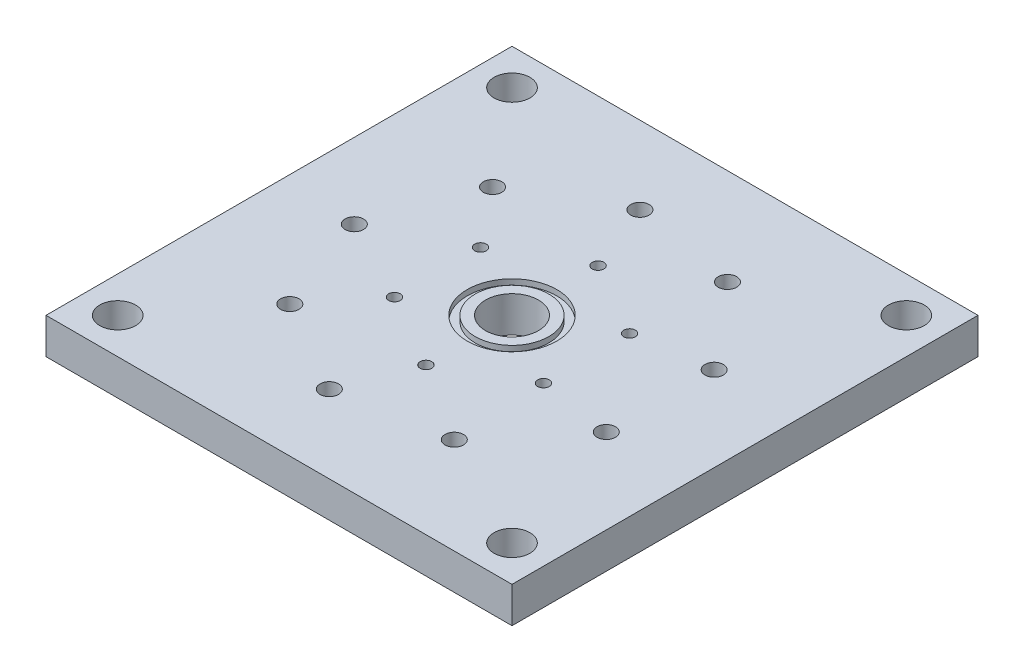
ISO-10303-21;
HEADER;
FILE_DESCRIPTION(('STEP AP214'),'2;1');
FILE_NAME('part.step','',(''),(''),'','','');
FILE_SCHEMA(('AUTOMOTIVE_DESIGN { 1 0 10303 214 1 1 1 1 }'));
ENDSEC;
DATA;
#1=APPLICATION_CONTEXT('core data for automotive mechanical design processes');
#2=APPLICATION_PROTOCOL_DEFINITION('international standard','automotive_design',2000,#1);
#3=PRODUCT_CONTEXT('',#1,'mechanical');
#4=PRODUCT('Part','Part','',(#3));
#5=PRODUCT_RELATED_PRODUCT_CATEGORY('part','',(#4));
#6=PRODUCT_DEFINITION_FORMATION('','',#4);
#7=PRODUCT_DEFINITION_CONTEXT('part definition',#1,'design');
#8=PRODUCT_DEFINITION('design','',#6,#7);
#9=PRODUCT_DEFINITION_SHAPE('','',#8);
#10=(LENGTH_UNIT() NAMED_UNIT(*) SI_UNIT(.MILLI.,.METRE.));
#11=(NAMED_UNIT(*) PLANE_ANGLE_UNIT() SI_UNIT($,.RADIAN.));
#12=(NAMED_UNIT(*) SI_UNIT($,.STERADIAN.) SOLID_ANGLE_UNIT());
#13=UNCERTAINTY_MEASURE_WITH_UNIT(LENGTH_MEASURE(1.E-05),#10,'distance_accuracy_value','');
#14=(GEOMETRIC_REPRESENTATION_CONTEXT(3) GLOBAL_UNCERTAINTY_ASSIGNED_CONTEXT((#13)) GLOBAL_UNIT_ASSIGNED_CONTEXT((#10,
#11,#12)) REPRESENTATION_CONTEXT('',''));
#15=CARTESIAN_POINT('',(0.,0.,0.));
#16=DIRECTION('',(0.,0.,1.));
#17=DIRECTION('',(1.,0.,0.));
#18=AXIS2_PLACEMENT_3D('',#15,#16,#17);
#19=CARTESIAN_POINT('',(0.,6.35,0.));
#20=DIRECTION('',(0.,-1.,0.));
#21=DIRECTION('',(0.,0.,-1.));
#22=AXIS2_PLACEMENT_3D('',#19,#20,#21);
#23=PLANE('',#22);
#24=CARTESIAN_POINT('',(0.,6.35,0.));
#25=DIRECTION('',(0.,1.,0.));
#26=DIRECTION('',(0.,0.,1.));
#27=AXIS2_PLACEMENT_3D('',#24,#25,#26);
#28=CIRCLE('',#27,4.699);
#29=CARTESIAN_POINT('',(0.,6.35,4.699));
#30=VERTEX_POINT('',#29);
#31=EDGE_CURVE('E102',#30,#30,#28,.T.);
#32=ORIENTED_EDGE('',*,*,#31,.F.);
#33=EDGE_LOOP('',(#32));
#34=FACE_BOUND('',#33,.T.);
#35=CARTESIAN_POINT('',(0.,6.35,0.));
#36=DIRECTION('',(0.,1.,0.));
#37=DIRECTION('',(0.,0.,1.));
#38=AXIS2_PLACEMENT_3D('',#35,#36,#37);
#39=CIRCLE('',#38,6.5278);
#40=CARTESIAN_POINT('',(0.,6.35,6.5278));
#41=VERTEX_POINT('',#40);
#42=EDGE_CURVE('E125',#41,#41,#39,.T.);
#43=ORIENTED_EDGE('',*,*,#42,.T.);
#44=EDGE_LOOP('',(#43));
#45=FACE_BOUND('',#44,.T.);
#46=ADVANCED_FACE('F35',(#34,#45),#23,.F.);
#47=CARTESIAN_POINT('',(41.275,6.35,41.275));
#48=DIRECTION('',(-1.,0.,0.));
#49=DIRECTION('',(0.,0.,1.));
#50=AXIS2_PLACEMENT_3D('',#47,#48,#49);
#51=PLANE('',#50);
#52=DIRECTION('',(0.,0.,-1.));
#53=VECTOR('',#52,1.);
#54=CARTESIAN_POINT('',(41.275,0.,41.275));
#55=LINE('',#54,#53);
#56=CARTESIAN_POINT('',(41.275,0.,41.275));
#57=VERTEX_POINT('',#56);
#58=CARTESIAN_POINT('',(41.275,0.,-41.275));
#59=VERTEX_POINT('',#58);
#60=EDGE_CURVE('E99',#57,#59,#55,.T.);
#61=ORIENTED_EDGE('',*,*,#60,.T.);
#62=DIRECTION('',(0.,-1.,0.));
#63=VECTOR('',#62,1.);
#64=CARTESIAN_POINT('',(41.275,6.35,-41.275));
#65=LINE('',#64,#63);
#66=CARTESIAN_POINT('',(41.275,6.35,-41.275));
#67=VERTEX_POINT('',#66);
#68=EDGE_CURVE('E11',#67,#59,#65,.T.);
#69=ORIENTED_EDGE('',*,*,#68,.F.);
#70=DIRECTION('',(0.,0.,-1.));
#71=VECTOR('',#70,1.);
#72=CARTESIAN_POINT('',(41.275,6.35,41.275));
#73=LINE('',#72,#71);
#74=CARTESIAN_POINT('',(41.275,6.35,41.275));
#75=VERTEX_POINT('',#74);
#76=EDGE_CURVE('E87',#75,#67,#73,.T.);
#77=ORIENTED_EDGE('',*,*,#76,.F.);
#78=DIRECTION('',(0.,-1.,0.));
#79=VECTOR('',#78,1.);
#80=CARTESIAN_POINT('',(41.275,6.35,41.275));
#81=LINE('',#80,#79);
#82=EDGE_CURVE('E95',#75,#57,#81,.T.);
#83=ORIENTED_EDGE('',*,*,#82,.T.);
#84=EDGE_LOOP('',(#61,#69,#77,#83));
#85=FACE_BOUND('',#84,.T.);
#86=ADVANCED_FACE('F37',(#85),#51,.F.);
#87=CARTESIAN_POINT('',(-41.275,6.35,-41.275));
#88=DIRECTION('',(0.,0.,1.));
#89=DIRECTION('',(1.,0.,0.));
#90=AXIS2_PLACEMENT_3D('',#87,#88,#89);
#91=PLANE('',#90);
#92=DIRECTION('',(-1.,0.,0.));
#93=VECTOR('',#92,1.);
#94=CARTESIAN_POINT('',(-41.275,0.,-41.275));
#95=LINE('',#94,#93);
#96=CARTESIAN_POINT('',(-41.275,0.,-41.275));
#97=VERTEX_POINT('',#96);
#98=EDGE_CURVE('E91',#59,#97,#95,.T.);
#99=ORIENTED_EDGE('',*,*,#98,.T.);
#100=DIRECTION('',(0.,-1.,0.));
#101=VECTOR('',#100,1.);
#102=CARTESIAN_POINT('',(-41.275,6.35,-41.275));
#103=LINE('',#102,#101);
#104=CARTESIAN_POINT('',(-41.275,6.35,-41.275));
#105=VERTEX_POINT('',#104);
#106=EDGE_CURVE('E44',#105,#97,#103,.T.);
#107=ORIENTED_EDGE('',*,*,#106,.F.);
#108=DIRECTION('',(-1.,0.,0.));
#109=VECTOR('',#108,1.);
#110=CARTESIAN_POINT('',(-41.275,6.35,-41.275));
#111=LINE('',#110,#109);
#112=EDGE_CURVE('E82',#67,#105,#111,.T.);
#113=ORIENTED_EDGE('',*,*,#112,.F.);
#114=ORIENTED_EDGE('',*,*,#68,.T.);
#115=EDGE_LOOP('',(#99,#107,#113,#114));
#116=FACE_BOUND('',#115,.T.);
#117=ADVANCED_FACE('F90',(#116),#91,.F.);
#118=CARTESIAN_POINT('',(-41.275,6.35,41.275));
#119=DIRECTION('',(1.,0.,0.));
#120=DIRECTION('',(0.,0.,-1.));
#121=AXIS2_PLACEMENT_3D('',#118,#119,#120);
#122=PLANE('',#121);
#123=DIRECTION('',(0.,0.,1.));
#124=VECTOR('',#123,1.);
#125=CARTESIAN_POINT('',(-41.275,0.,41.275));
#126=LINE('',#125,#124);
#127=CARTESIAN_POINT('',(-41.275,0.,41.275));
#128=VERTEX_POINT('',#127);
#129=EDGE_CURVE('E69',#97,#128,#126,.T.);
#130=ORIENTED_EDGE('',*,*,#129,.T.);
#131=DIRECTION('',(0.,-1.,0.));
#132=VECTOR('',#131,1.);
#133=CARTESIAN_POINT('',(-41.275,6.35,41.275));
#134=LINE('',#133,#132);
#135=CARTESIAN_POINT('',(-41.275,6.35,41.275));
#136=VERTEX_POINT('',#135);
#137=EDGE_CURVE('E92',#136,#128,#134,.T.);
#138=ORIENTED_EDGE('',*,*,#137,.F.);
#139=DIRECTION('',(0.,0.,1.));
#140=VECTOR('',#139,1.);
#141=CARTESIAN_POINT('',(-41.275,6.35,41.275));
#142=LINE('',#141,#140);
#143=EDGE_CURVE('E85',#105,#136,#142,.T.);
#144=ORIENTED_EDGE('',*,*,#143,.F.);
#145=ORIENTED_EDGE('',*,*,#106,.T.);
#146=EDGE_LOOP('',(#130,#138,#144,#145));
#147=FACE_BOUND('',#146,.T.);
#148=ADVANCED_FACE('F93',(#147),#122,.F.);
#149=CARTESIAN_POINT('',(-41.275,6.35,41.275));
#150=DIRECTION('',(0.,0.,-1.));
#151=DIRECTION('',(-1.,0.,0.));
#152=AXIS2_PLACEMENT_3D('',#149,#150,#151);
#153=PLANE('',#152);
#154=DIRECTION('',(1.,0.,0.));
#155=VECTOR('',#154,1.);
#156=CARTESIAN_POINT('',(-41.275,0.,41.275));
#157=LINE('',#156,#155);
#158=EDGE_CURVE('E75',#128,#57,#157,.T.);
#159=ORIENTED_EDGE('',*,*,#158,.T.);
#160=ORIENTED_EDGE('',*,*,#82,.F.);
#161=DIRECTION('',(1.,0.,0.));
#162=VECTOR('',#161,1.);
#163=CARTESIAN_POINT('',(-41.275,6.35,41.275));
#164=LINE('',#163,#162);
#165=EDGE_CURVE('E52',#136,#75,#164,.T.);
#166=ORIENTED_EDGE('',*,*,#165,.F.);
#167=ORIENTED_EDGE('',*,*,#137,.T.);
#168=EDGE_LOOP('',(#159,#160,#166,#167));
#169=FACE_BOUND('',#168,.T.);
#170=ADVANCED_FACE('F107',(#169),#153,.F.);
#171=CARTESIAN_POINT('',(-34.925,6.35,-34.925));
#172=DIRECTION('',(0.,1.,0.));
#173=DIRECTION('',(0.,0.,-1.));
#174=AXIS2_PLACEMENT_3D('',#171,#172,#173);
#175=CIRCLE('',#174,3.175);
#176=CARTESIAN_POINT('',(-34.925,6.35,-38.1));
#177=VERTEX_POINT('',#176);
#178=EDGE_CURVE('E236',#177,#177,#175,.T.);
#179=ORIENTED_EDGE('',*,*,#178,.F.);
#180=EDGE_LOOP('',(#179));
#181=FACE_BOUND('',#180,.T.);
#182=CARTESIAN_POINT('',(-34.925,6.35,34.925));
#183=DIRECTION('',(0.,1.,0.));
#184=DIRECTION('',(0.,0.,1.));
#185=AXIS2_PLACEMENT_3D('',#182,#183,#184);
#186=CIRCLE('',#185,3.175);
#187=CARTESIAN_POINT('',(-34.925,6.35,38.1));
#188=VERTEX_POINT('',#187);
#189=EDGE_CURVE('E230',#188,#188,#186,.T.);
#190=ORIENTED_EDGE('',*,*,#189,.F.);
#191=EDGE_LOOP('',(#190));
#192=FACE_BOUND('',#191,.T.);
#193=CARTESIAN_POINT('',(34.925,6.35,34.925));
#194=DIRECTION('',(0.,1.,0.));
#195=DIRECTION('',(0.,0.,-1.));
#196=AXIS2_PLACEMENT_3D('',#193,#194,#195);
#197=CIRCLE('',#196,3.175);
#198=CARTESIAN_POINT('',(34.925,6.35,31.75));
#199=VERTEX_POINT('',#198);
#200=EDGE_CURVE('E224',#199,#199,#197,.T.);
#201=ORIENTED_EDGE('',*,*,#200,.F.);
#202=EDGE_LOOP('',(#201));
#203=FACE_BOUND('',#202,.T.);
#204=CARTESIAN_POINT('',(34.925,6.35,-34.925));
#205=DIRECTION('',(0.,1.,0.));
#206=DIRECTION('',(0.,0.,1.));
#207=AXIS2_PLACEMENT_3D('',#204,#205,#206);
#208=CIRCLE('',#207,3.175);
#209=CARTESIAN_POINT('',(34.925,6.35,-31.75));
#210=VERTEX_POINT('',#209);
#211=EDGE_CURVE('E218',#210,#210,#208,.T.);
#212=ORIENTED_EDGE('',*,*,#211,.F.);
#213=EDGE_LOOP('',(#212));
#214=FACE_BOUND('',#213,.T.);
#215=CARTESIAN_POINT('',(-4.8517300840137,6.35,27.5155286191612));
#216=DIRECTION('',(0.,1.,0.));
#217=DIRECTION('',(-0.64278760968653,0.,0.766044443118986));
#218=AXIS2_PLACEMENT_3D('',#215,#216,#217);
#219=CIRCLE('',#218,1.63195);
#220=CARTESIAN_POINT('',(-5.90072732364164,6.35,28.7656748481092));
#221=VERTEX_POINT('',#220);
#222=EDGE_CURVE('E212',#221,#221,#219,.T.);
#223=ORIENTED_EDGE('',*,*,#222,.F.);
#224=EDGE_LOOP('',(#223));
#225=FACE_BOUND('',#224,.T.);
#226=CARTESIAN_POINT('',(-21.4032817407441,6.35,17.9594858146421));
#227=DIRECTION('',(0.,1.,0.));
#228=DIRECTION('',(-0.984807753012206,0.,0.17364817766694));
#229=AXIS2_PLACEMENT_3D('',#226,#227,#228);
#230=CIRCLE('',#229,1.63195);
#231=CARTESIAN_POINT('',(-23.0104387532723,6.35,18.2428709581857));
#232=VERTEX_POINT('',#231);
#233=EDGE_CURVE('E206',#232,#232,#230,.T.);
#234=ORIENTED_EDGE('',*,*,#233,.F.);
#235=EDGE_LOOP('',(#234));
#236=FACE_BOUND('',#235,.T.);
#237=CARTESIAN_POINT('',(-27.94,6.35,2.60208521396521E-13));
#238=DIRECTION('',(0.,1.,0.));
#239=DIRECTION('',(-0.866025403784443,0.,-0.499999999999992));
#240=AXIS2_PLACEMENT_3D('',#237,#238,#239);
#241=CIRCLE('',#240,1.63195);
#242=CARTESIAN_POINT('',(-29.353310157706,6.35,-0.815974999999728));
#243=VERTEX_POINT('',#242);
#244=EDGE_CURVE('E200',#243,#243,#241,.T.);
#245=ORIENTED_EDGE('',*,*,#244,.F.);
#246=EDGE_LOOP('',(#245));
#247=FACE_BOUND('',#246,.T.);
#248=CARTESIAN_POINT('',(-21.4032817407444,6.35,-17.9594858146418));
#249=DIRECTION('',(0.,1.,0.));
#250=DIRECTION('',(-0.342020143325676,0.,-0.939692620785906));
#251=AXIS2_PLACEMENT_3D('',#248,#249,#250);
#252=CIRCLE('',#251,1.63195);
#253=CARTESIAN_POINT('',(-21.9614415136447,6.35,-19.4930171871333));
#254=VERTEX_POINT('',#253);
#255=EDGE_CURVE('E194',#254,#254,#252,.T.);
#256=ORIENTED_EDGE('',*,*,#255,.F.);
#257=EDGE_LOOP('',(#256));
#258=FACE_BOUND('',#257,.T.);
#259=CARTESIAN_POINT('',(-4.8517300840142,6.35,-27.5155286191611));
#260=DIRECTION('',(0.,1.,0.));
#261=DIRECTION('',(0.342020143325663,0.,-0.939692620785911));
#262=AXIS2_PLACEMENT_3D('',#259,#260,#261);
#263=CIRCLE('',#262,1.63195);
#264=CARTESIAN_POINT('',(-4.29357031111389,6.35,-29.0490599916526));
#265=VERTEX_POINT('',#264);
#266=EDGE_CURVE('E188',#265,#265,#263,.T.);
#267=ORIENTED_EDGE('',*,*,#266,.F.);
#268=EDGE_LOOP('',(#267));
#269=FACE_BOUND('',#268,.T.);
#270=CARTESIAN_POINT('',(13.9699999999999,6.35,-24.1967497817373));
#271=DIRECTION('',(0.,1.,0.));
#272=DIRECTION('',(0.866025403784436,0.,-0.500000000000004));
#273=AXIS2_PLACEMENT_3D('',#270,#271,#272);
#274=CIRCLE('',#273,1.63195);
#275=CARTESIAN_POINT('',(15.3833101577059,6.35,-25.0127247817373));
#276=VERTEX_POINT('',#275);
#277=EDGE_CURVE('E182',#276,#276,#274,.T.);
#278=ORIENTED_EDGE('',*,*,#277,.F.);
#279=EDGE_LOOP('',(#278));
#280=FACE_BOUND('',#279,.T.);
#281=CARTESIAN_POINT('',(26.2550118247583,6.35,-9.55604280451926));
#282=DIRECTION('',(0.,1.,0.));
#283=DIRECTION('',(0.984807753012209,0.,0.173648177666927));
#284=AXIS2_PLACEMENT_3D('',#281,#282,#283);
#285=CIRCLE('',#284,1.63195);
#286=CARTESIAN_POINT('',(27.8621688372865,6.35,-9.27265766097572));
#287=VERTEX_POINT('',#286);
#288=EDGE_CURVE('E176',#287,#287,#285,.T.);
#289=ORIENTED_EDGE('',*,*,#288,.F.);
#290=EDGE_LOOP('',(#289));
#291=FACE_BOUND('',#290,.T.);
#292=CARTESIAN_POINT('',(26.2550118247583,6.35,9.55604280451915));
#293=DIRECTION('',(0.,1.,0.));
#294=DIRECTION('',(0.642787609686541,0.,0.766044443118977));
#295=AXIS2_PLACEMENT_3D('',#292,#293,#294);
#296=CIRCLE('',#295,1.63195);
#297=CARTESIAN_POINT('',(27.3040090643863,6.35,10.8061890334672));
#298=VERTEX_POINT('',#297);
#299=EDGE_CURVE('E170',#298,#298,#296,.T.);
#300=ORIENTED_EDGE('',*,*,#299,.F.);
#301=EDGE_LOOP('',(#300));
#302=FACE_BOUND('',#301,.T.);
#303=CARTESIAN_POINT('',(13.97,6.35,24.1967497817372));
#304=DIRECTION('',(0.,1.,0.));
#305=DIRECTION('',(0.,0.,1.));
#306=AXIS2_PLACEMENT_3D('',#303,#304,#305);
#307=CIRCLE('',#306,1.63195);
#308=CARTESIAN_POINT('',(13.97,6.35,25.8286997817372));
#309=VERTEX_POINT('',#308);
#310=EDGE_CURVE('E164',#309,#309,#307,.T.);
#311=ORIENTED_EDGE('',*,*,#310,.F.);
#312=EDGE_LOOP('',(#311));
#313=FACE_BOUND('',#312,.T.);
#314=CARTESIAN_POINT('',(-13.1982271536748,6.35,7.62000000000015));
#315=DIRECTION('',(0.,1.,0.));
#316=DIRECTION('',(-0.866025403784433,0.,0.50000000000001));
#317=AXIS2_PLACEMENT_3D('',#314,#315,#316);
#318=CIRCLE('',#317,1.03251);
#319=CARTESIAN_POINT('',(-14.0924070433362,6.35,8.13625500000017));
#320=VERTEX_POINT('',#319);
#321=EDGE_CURVE('E161',#320,#320,#318,.T.);
#322=ORIENTED_EDGE('',*,*,#321,.F.);
#323=EDGE_LOOP('',(#322));
#324=FACE_BOUND('',#323,.T.);
#325=CARTESIAN_POINT('',(-13.1982271536749,6.35,-7.61999999999988));
#326=DIRECTION('',(0.,1.,0.));
#327=DIRECTION('',(-0.866025403784443,0.,-0.499999999999992));
#328=AXIS2_PLACEMENT_3D('',#325,#326,#327);
#329=CIRCLE('',#328,1.03251);
#330=CARTESIAN_POINT('',(-14.0924070433364,6.35,-8.13625499999987));
#331=VERTEX_POINT('',#330);
#332=EDGE_CURVE('E155',#331,#331,#329,.T.);
#333=ORIENTED_EDGE('',*,*,#332,.F.);
#334=EDGE_LOOP('',(#333));
#335=FACE_BOUND('',#334,.T.);
#336=CARTESIAN_POINT('',(0.,6.35,-15.24));
#337=DIRECTION('',(0.,1.,0.));
#338=DIRECTION('',(0.,0.,-1.));
#339=AXIS2_PLACEMENT_3D('',#336,#337,#338);
#340=CIRCLE('',#339,1.03251);
#341=CARTESIAN_POINT('',(0.,6.35,-16.27251));
#342=VERTEX_POINT('',#341);
#343=EDGE_CURVE('E149',#342,#342,#340,.T.);
#344=ORIENTED_EDGE('',*,*,#343,.F.);
#345=EDGE_LOOP('',(#344));
#346=FACE_BOUND('',#345,.T.);
#347=CARTESIAN_POINT('',(13.1982271536748,6.35,-7.62000000000006));
#348=DIRECTION('',(0.,1.,0.));
#349=DIRECTION('',(0.866025403784436,0.,-0.500000000000004));
#350=AXIS2_PLACEMENT_3D('',#347,#348,#349);
#351=CIRCLE('',#350,1.03251);
#352=CARTESIAN_POINT('',(14.0924070433363,6.35,-8.13625500000007));
#353=VERTEX_POINT('',#352);
#354=EDGE_CURVE('E143',#353,#353,#351,.T.);
#355=ORIENTED_EDGE('',*,*,#354,.F.);
#356=EDGE_LOOP('',(#355));
#357=FACE_BOUND('',#356,.T.);
#358=CARTESIAN_POINT('',(13.1982271536749,6.35,7.61999999999997));
#359=DIRECTION('',(0.,1.,0.));
#360=DIRECTION('',(0.86602540378444,0.,0.499999999999998));
#361=AXIS2_PLACEMENT_3D('',#358,#359,#360);
#362=CIRCLE('',#361,1.03251);
#363=CARTESIAN_POINT('',(14.0924070433363,6.35,8.13625499999997));
#364=VERTEX_POINT('',#363);
#365=EDGE_CURVE('E137',#364,#364,#362,.T.);
#366=ORIENTED_EDGE('',*,*,#365,.F.);
#367=EDGE_LOOP('',(#366));
#368=FACE_BOUND('',#367,.T.);
#369=CARTESIAN_POINT('',(0.,6.35,15.24));
#370=DIRECTION('',(0.,1.,0.));
#371=DIRECTION('',(0.,0.,1.));
#372=AXIS2_PLACEMENT_3D('',#369,#370,#371);
#373=CIRCLE('',#372,1.03251);
#374=CARTESIAN_POINT('',(0.,6.35,16.27251));
#375=VERTEX_POINT('',#374);
#376=EDGE_CURVE('E131',#375,#375,#373,.T.);
#377=ORIENTED_EDGE('',*,*,#376,.F.);
#378=EDGE_LOOP('',(#377));
#379=FACE_BOUND('',#378,.T.);
#380=CARTESIAN_POINT('',(0.,6.35,0.));
#381=DIRECTION('',(0.,1.,0.));
#382=DIRECTION('',(0.,0.,1.));
#383=AXIS2_PLACEMENT_3D('',#380,#381,#382);
#384=CIRCLE('',#383,7.9248);
#385=CARTESIAN_POINT('',(0.,6.35,7.9248));
#386=VERTEX_POINT('',#385);
#387=EDGE_CURVE('E119',#386,#386,#384,.T.);
#388=ORIENTED_EDGE('',*,*,#387,.F.);
#389=EDGE_LOOP('',(#388));
#390=FACE_BOUND('',#389,.T.);
#391=ORIENTED_EDGE('',*,*,#76,.T.);
#392=ORIENTED_EDGE('',*,*,#112,.T.);
#393=ORIENTED_EDGE('',*,*,#143,.T.);
#394=ORIENTED_EDGE('',*,*,#165,.T.);
#395=EDGE_LOOP('',(#391,#392,#393,#394));
#396=FACE_BOUND('',#395,.T.);
#397=ADVANCED_FACE('F83',(#181,#192,#203,#214,#225,#236,#247,#258,#269,#280,#291,#302,#313,#324,
#335,#346,#357,#368,#379,#390,#396),#23,.F.);
#398=CARTESIAN_POINT('',(0.,0.,0.));
#399=DIRECTION('',(0.,-1.,0.));
#400=DIRECTION('',(0.,0.,-1.));
#401=AXIS2_PLACEMENT_3D('',#398,#399,#400);
#402=PLANE('',#401);
#403=CARTESIAN_POINT('',(-34.925,0.,-34.925));
#404=DIRECTION('',(0.,-1.,0.));
#405=DIRECTION('',(0.,0.,-1.));
#406=AXIS2_PLACEMENT_3D('',#403,#404,#405);
#407=CIRCLE('',#406,3.175);
#408=CARTESIAN_POINT('',(-34.925,0.,-38.1));
#409=VERTEX_POINT('',#408);
#410=EDGE_CURVE('E239',#409,#409,#407,.F.);
#411=ORIENTED_EDGE('',*,*,#410,.T.);
#412=EDGE_LOOP('',(#411));
#413=FACE_BOUND('',#412,.T.);
#414=CARTESIAN_POINT('',(-34.925,0.,34.925));
#415=DIRECTION('',(0.,-1.,0.));
#416=DIRECTION('',(0.,0.,-1.));
#417=AXIS2_PLACEMENT_3D('',#414,#415,#416);
#418=CIRCLE('',#417,3.175);
#419=CARTESIAN_POINT('',(-34.925,0.,31.75));
#420=VERTEX_POINT('',#419);
#421=EDGE_CURVE('E233',#420,#420,#418,.F.);
#422=ORIENTED_EDGE('',*,*,#421,.T.);
#423=EDGE_LOOP('',(#422));
#424=FACE_BOUND('',#423,.T.);
#425=CARTESIAN_POINT('',(34.925,0.,34.925));
#426=DIRECTION('',(0.,-1.,0.));
#427=DIRECTION('',(0.,0.,-1.));
#428=AXIS2_PLACEMENT_3D('',#425,#426,#427);
#429=CIRCLE('',#428,3.175);
#430=CARTESIAN_POINT('',(34.925,0.,31.75));
#431=VERTEX_POINT('',#430);
#432=EDGE_CURVE('E227',#431,#431,#429,.F.);
#433=ORIENTED_EDGE('',*,*,#432,.T.);
#434=EDGE_LOOP('',(#433));
#435=FACE_BOUND('',#434,.T.);
#436=CARTESIAN_POINT('',(34.925,0.,-34.925));
#437=DIRECTION('',(0.,-1.,0.));
#438=DIRECTION('',(0.,0.,-1.));
#439=AXIS2_PLACEMENT_3D('',#436,#437,#438);
#440=CIRCLE('',#439,3.175);
#441=CARTESIAN_POINT('',(34.925,0.,-38.1));
#442=VERTEX_POINT('',#441);
#443=EDGE_CURVE('E221',#442,#442,#440,.F.);
#444=ORIENTED_EDGE('',*,*,#443,.T.);
#445=EDGE_LOOP('',(#444));
#446=FACE_BOUND('',#445,.T.);
#447=CARTESIAN_POINT('',(-4.8517300840137,0.,27.5155286191612));
#448=DIRECTION('',(0.,-1.,0.));
#449=DIRECTION('',(0.,0.,-1.));
#450=AXIS2_PLACEMENT_3D('',#447,#448,#449);
#451=CIRCLE('',#450,1.63195);
#452=CARTESIAN_POINT('',(-4.8517300840137,0.,25.8835786191612));
#453=VERTEX_POINT('',#452);
#454=EDGE_CURVE('E215',#453,#453,#451,.F.);
#455=ORIENTED_EDGE('',*,*,#454,.T.);
#456=EDGE_LOOP('',(#455));
#457=FACE_BOUND('',#456,.T.);
#458=CARTESIAN_POINT('',(-21.4032817407441,0.,17.9594858146421));
#459=DIRECTION('',(0.,-1.,0.));
#460=DIRECTION('',(0.,0.,-1.));
#461=AXIS2_PLACEMENT_3D('',#458,#459,#460);
#462=CIRCLE('',#461,1.63195);
#463=CARTESIAN_POINT('',(-21.4032817407441,0.,16.3275358146421));
#464=VERTEX_POINT('',#463);
#465=EDGE_CURVE('E209',#464,#464,#462,.F.);
#466=ORIENTED_EDGE('',*,*,#465,.T.);
#467=EDGE_LOOP('',(#466));
#468=FACE_BOUND('',#467,.T.);
#469=CARTESIAN_POINT('',(-27.94,0.,2.60208521396521E-13));
#470=DIRECTION('',(0.,-1.,0.));
#471=DIRECTION('',(0.,0.,-1.));
#472=AXIS2_PLACEMENT_3D('',#469,#470,#471);
#473=CIRCLE('',#472,1.63195);
#474=CARTESIAN_POINT('',(-27.94,0.,-1.63194999999974));
#475=VERTEX_POINT('',#474);
#476=EDGE_CURVE('E203',#475,#475,#473,.F.);
#477=ORIENTED_EDGE('',*,*,#476,.T.);
#478=EDGE_LOOP('',(#477));
#479=FACE_BOUND('',#478,.T.);
#480=CARTESIAN_POINT('',(-21.4032817407444,0.,-17.9594858146418));
#481=DIRECTION('',(0.,-1.,0.));
#482=DIRECTION('',(0.,0.,-1.));
#483=AXIS2_PLACEMENT_3D('',#480,#481,#482);
#484=CIRCLE('',#483,1.63195);
#485=CARTESIAN_POINT('',(-21.4032817407444,0.,-19.5914358146418));
#486=VERTEX_POINT('',#485);
#487=EDGE_CURVE('E197',#486,#486,#484,.F.);
#488=ORIENTED_EDGE('',*,*,#487,.T.);
#489=EDGE_LOOP('',(#488));
#490=FACE_BOUND('',#489,.T.);
#491=CARTESIAN_POINT('',(-4.8517300840142,0.,-27.5155286191611));
#492=DIRECTION('',(0.,-1.,0.));
#493=DIRECTION('',(0.,0.,-1.));
#494=AXIS2_PLACEMENT_3D('',#491,#492,#493);
#495=CIRCLE('',#494,1.63195);
#496=CARTESIAN_POINT('',(-4.8517300840142,0.,-29.1474786191611));
#497=VERTEX_POINT('',#496);
#498=EDGE_CURVE('E191',#497,#497,#495,.F.);
#499=ORIENTED_EDGE('',*,*,#498,.T.);
#500=EDGE_LOOP('',(#499));
#501=FACE_BOUND('',#500,.T.);
#502=CARTESIAN_POINT('',(13.9699999999999,0.,-24.1967497817373));
#503=DIRECTION('',(0.,-1.,0.));
#504=DIRECTION('',(0.,0.,-1.));
#505=AXIS2_PLACEMENT_3D('',#502,#503,#504);
#506=CIRCLE('',#505,1.63195);
#507=CARTESIAN_POINT('',(13.9699999999999,0.,-25.8286997817373));
#508=VERTEX_POINT('',#507);
#509=EDGE_CURVE('E185',#508,#508,#506,.F.);
#510=ORIENTED_EDGE('',*,*,#509,.T.);
#511=EDGE_LOOP('',(#510));
#512=FACE_BOUND('',#511,.T.);
#513=CARTESIAN_POINT('',(26.2550118247583,0.,-9.55604280451927));
#514=DIRECTION('',(0.,-1.,0.));
#515=DIRECTION('',(0.,0.,-1.));
#516=AXIS2_PLACEMENT_3D('',#513,#514,#515);
#517=CIRCLE('',#516,1.63195);
#518=CARTESIAN_POINT('',(26.2550118247583,0.,-11.1879928045193));
#519=VERTEX_POINT('',#518);
#520=EDGE_CURVE('E179',#519,#519,#517,.F.);
#521=ORIENTED_EDGE('',*,*,#520,.T.);
#522=EDGE_LOOP('',(#521));
#523=FACE_BOUND('',#522,.T.);
#524=CARTESIAN_POINT('',(26.2550118247583,0.,9.55604280451915));
#525=DIRECTION('',(0.,-1.,0.));
#526=DIRECTION('',(0.,0.,-1.));
#527=AXIS2_PLACEMENT_3D('',#524,#525,#526);
#528=CIRCLE('',#527,1.63195);
#529=CARTESIAN_POINT('',(26.2550118247583,0.,7.92409280451915));
#530=VERTEX_POINT('',#529);
#531=EDGE_CURVE('E173',#530,#530,#528,.F.);
#532=ORIENTED_EDGE('',*,*,#531,.T.);
#533=EDGE_LOOP('',(#532));
#534=FACE_BOUND('',#533,.T.);
#535=CARTESIAN_POINT('',(13.97,0.,24.1967497817372));
#536=DIRECTION('',(0.,-1.,0.));
#537=DIRECTION('',(0.,0.,-1.));
#538=AXIS2_PLACEMENT_3D('',#535,#536,#537);
#539=CIRCLE('',#538,1.63195);
#540=CARTESIAN_POINT('',(13.97,0.,22.5647997817372));
#541=VERTEX_POINT('',#540);
#542=EDGE_CURVE('E167',#541,#541,#539,.F.);
#543=ORIENTED_EDGE('',*,*,#542,.T.);
#544=EDGE_LOOP('',(#543));
#545=FACE_BOUND('',#544,.T.);
#546=CARTESIAN_POINT('',(0.,0.,0.));
#547=DIRECTION('',(0.,-1.,0.));
#548=DIRECTION('',(0.,0.,-1.));
#549=AXIS2_PLACEMENT_3D('',#546,#547,#548);
#550=CIRCLE('',#549,4.699);
#551=CARTESIAN_POINT('',(0.,0.,-4.699));
#552=VERTEX_POINT('',#551);
#553=EDGE_CURVE('E113',#552,#552,#550,.F.);
#554=ORIENTED_EDGE('',*,*,#553,.T.);
#555=EDGE_LOOP('',(#554));
#556=FACE_BOUND('',#555,.T.);
#557=ORIENTED_EDGE('',*,*,#60,.F.);
#558=ORIENTED_EDGE('',*,*,#158,.F.);
#559=ORIENTED_EDGE('',*,*,#129,.F.);
#560=ORIENTED_EDGE('',*,*,#98,.F.);
#561=EDGE_LOOP('',(#557,#558,#559,#560));
#562=FACE_BOUND('',#561,.T.);
#563=ADVANCED_FACE('F110',(#413,#424,#435,#446,#457,#468,#479,#490,#501,#512,#523,#534,#545,
#556,#562),#402,.T.);
#564=CARTESIAN_POINT('',(0.,-0.001000000000001,0.));
#565=DIRECTION('',(0.,1.,0.));
#566=DIRECTION('',(0.,0.,1.));
#567=AXIS2_PLACEMENT_3D('',#564,#565,#566);
#568=CYLINDRICAL_SURFACE('',#567,4.699);
#569=ORIENTED_EDGE('',*,*,#553,.F.);
#570=EDGE_LOOP('',(#569));
#571=FACE_BOUND('',#570,.T.);
#572=ORIENTED_EDGE('',*,*,#31,.T.);
#573=EDGE_LOOP('',(#572));
#574=FACE_BOUND('',#573,.T.);
#575=ADVANCED_FACE('F291',(#571,#574),#568,.F.);
#576=CARTESIAN_POINT('',(0.,5.3721,0.));
#577=DIRECTION('',(0.,1.,0.));
#578=DIRECTION('',(0.,0.,1.));
#579=AXIS2_PLACEMENT_3D('',#576,#577,#578);
#580=CYLINDRICAL_SURFACE('',#579,7.9248);
#581=CARTESIAN_POINT('',(0.,5.3721,0.));
#582=DIRECTION('',(0.,1.,0.));
#583=DIRECTION('',(0.,0.,1.));
#584=AXIS2_PLACEMENT_3D('',#581,#582,#583);
#585=CIRCLE('',#584,7.9248);
#586=CARTESIAN_POINT('',(0.,5.3721,7.9248));
#587=VERTEX_POINT('',#586);
#588=EDGE_CURVE('E116',#587,#587,#585,.T.);
#589=ORIENTED_EDGE('',*,*,#588,.F.);
#590=EDGE_LOOP('',(#589));
#591=FACE_BOUND('',#590,.T.);
#592=ORIENTED_EDGE('',*,*,#387,.T.);
#593=EDGE_LOOP('',(#592));
#594=FACE_BOUND('',#593,.T.);
#595=ADVANCED_FACE('F288',(#591,#594),#580,.F.);
#596=CARTESIAN_POINT('',(0.,5.3721,0.));
#597=DIRECTION('',(0.,1.,0.));
#598=DIRECTION('',(0.,0.,1.));
#599=AXIS2_PLACEMENT_3D('',#596,#597,#598);
#600=PLANE('',#599);
#601=CARTESIAN_POINT('',(0.,5.3721,0.));
#602=DIRECTION('',(0.,1.,0.));
#603=DIRECTION('',(0.,0.,1.));
#604=AXIS2_PLACEMENT_3D('',#601,#602,#603);
#605=CIRCLE('',#604,6.5278);
#606=CARTESIAN_POINT('',(0.,5.3721,6.5278));
#607=VERTEX_POINT('',#606);
#608=EDGE_CURVE('E122',#607,#607,#605,.T.);
#609=ORIENTED_EDGE('',*,*,#608,.F.);
#610=EDGE_LOOP('',(#609));
#611=FACE_BOUND('',#610,.T.);
#612=ORIENTED_EDGE('',*,*,#588,.T.);
#613=EDGE_LOOP('',(#612));
#614=FACE_BOUND('',#613,.T.);
#615=ADVANCED_FACE('F290',(#611,#614),#600,.T.);
#616=CARTESIAN_POINT('',(0.,5.3721,0.));
#617=DIRECTION('',(0.,1.,0.));
#618=DIRECTION('',(0.,0.,1.));
#619=AXIS2_PLACEMENT_3D('',#616,#617,#618);
#620=CYLINDRICAL_SURFACE('',#619,6.5278);
#621=ORIENTED_EDGE('',*,*,#608,.T.);
#622=EDGE_LOOP('',(#621));
#623=FACE_BOUND('',#622,.T.);
#624=ORIENTED_EDGE('',*,*,#42,.F.);
#625=EDGE_LOOP('',(#624));
#626=FACE_BOUND('',#625,.T.);
#627=ADVANCED_FACE('F298',(#623,#626),#620,.T.);
#628=CARTESIAN_POINT('',(0.,3.175,15.24));
#629=DIRECTION('',(0.,1.,0.));
#630=DIRECTION('',(0.,0.,1.));
#631=AXIS2_PLACEMENT_3D('',#628,#629,#630);
#632=CYLINDRICAL_SURFACE('',#631,1.03251);
#633=CARTESIAN_POINT('',(0.,3.175,15.24));
#634=DIRECTION('',(0.,1.,0.));
#635=DIRECTION('',(0.,0.,1.));
#636=AXIS2_PLACEMENT_3D('',#633,#634,#635);
#637=CIRCLE('',#636,1.03251);
#638=CARTESIAN_POINT('',(0.,3.175,16.27251));
#639=VERTEX_POINT('',#638);
#640=EDGE_CURVE('E128',#639,#639,#637,.T.);
#641=ORIENTED_EDGE('',*,*,#640,.F.);
#642=EDGE_LOOP('',(#641));
#643=FACE_BOUND('',#642,.T.);
#644=ORIENTED_EDGE('',*,*,#376,.T.);
#645=EDGE_LOOP('',(#644));
#646=FACE_BOUND('',#645,.T.);
#647=ADVANCED_FACE('F358',(#643,#646),#632,.F.);
#648=CARTESIAN_POINT('',(0.,3.175,15.24));
#649=DIRECTION('',(0.,1.,0.));
#650=DIRECTION('',(0.,0.,1.));
#651=AXIS2_PLACEMENT_3D('',#648,#649,#650);
#652=PLANE('',#651);
#653=ORIENTED_EDGE('',*,*,#640,.T.);
#654=EDGE_LOOP('',(#653));
#655=FACE_BOUND('',#654,.T.);
#656=ADVANCED_FACE('F366',(#655),#652,.T.);
#657=CARTESIAN_POINT('',(13.1982271536749,3.175,7.61999999999997));
#658=DIRECTION('',(0.,1.,0.));
#659=DIRECTION('',(0.,0.,1.));
#660=AXIS2_PLACEMENT_3D('',#657,#658,#659);
#661=CYLINDRICAL_SURFACE('',#660,1.03251);
#662=CARTESIAN_POINT('',(13.1982271536749,3.175,7.61999999999997));
#663=DIRECTION('',(0.,1.,0.));
#664=DIRECTION('',(0.86602540378444,0.,0.499999999999998));
#665=AXIS2_PLACEMENT_3D('',#662,#663,#664);
#666=CIRCLE('',#665,1.03251);
#667=CARTESIAN_POINT('',(14.0924070433363,3.175,8.13625499999997));
#668=VERTEX_POINT('',#667);
#669=EDGE_CURVE('E134',#668,#668,#666,.T.);
#670=ORIENTED_EDGE('',*,*,#669,.F.);
#671=EDGE_LOOP('',(#670));
#672=FACE_BOUND('',#671,.T.);
#673=ORIENTED_EDGE('',*,*,#365,.T.);
#674=EDGE_LOOP('',(#673));
#675=FACE_BOUND('',#674,.T.);
#676=ADVANCED_FACE('F374',(#672,#675),#661,.F.);
#677=CARTESIAN_POINT('',(13.1982271536749,3.175,7.61999999999997));
#678=DIRECTION('',(0.,1.,0.));
#679=DIRECTION('',(0.86602540378444,0.,0.499999999999998));
#680=AXIS2_PLACEMENT_3D('',#677,#678,#679);
#681=PLANE('',#680);
#682=ORIENTED_EDGE('',*,*,#669,.T.);
#683=EDGE_LOOP('',(#682));
#684=FACE_BOUND('',#683,.T.);
#685=ADVANCED_FACE('F382',(#684),#681,.T.);
#686=CARTESIAN_POINT('',(13.1982271536748,3.175,-7.62000000000006));
#687=DIRECTION('',(0.,1.,0.));
#688=DIRECTION('',(0.,0.,1.));
#689=AXIS2_PLACEMENT_3D('',#686,#687,#688);
#690=CYLINDRICAL_SURFACE('',#689,1.03251);
#691=CARTESIAN_POINT('',(13.1982271536748,3.175,-7.62000000000006));
#692=DIRECTION('',(0.,1.,0.));
#693=DIRECTION('',(0.866025403784436,0.,-0.500000000000004));
#694=AXIS2_PLACEMENT_3D('',#691,#692,#693);
#695=CIRCLE('',#694,1.03251);
#696=CARTESIAN_POINT('',(14.0924070433363,3.175,-8.13625500000006));
#697=VERTEX_POINT('',#696);
#698=EDGE_CURVE('E140',#697,#697,#695,.T.);
#699=ORIENTED_EDGE('',*,*,#698,.F.);
#700=EDGE_LOOP('',(#699));
#701=FACE_BOUND('',#700,.T.);
#702=ORIENTED_EDGE('',*,*,#354,.T.);
#703=EDGE_LOOP('',(#702));
#704=FACE_BOUND('',#703,.T.);
#705=ADVANCED_FACE('F390',(#701,#704),#690,.F.);
#706=CARTESIAN_POINT('',(13.1982271536748,3.175,-7.62000000000006));
#707=DIRECTION('',(0.,1.,0.));
#708=DIRECTION('',(0.866025403784436,0.,-0.500000000000004));
#709=AXIS2_PLACEMENT_3D('',#706,#707,#708);
#710=PLANE('',#709);
#711=ORIENTED_EDGE('',*,*,#698,.T.);
#712=EDGE_LOOP('',(#711));
#713=FACE_BOUND('',#712,.T.);
#714=ADVANCED_FACE('F398',(#713),#710,.T.);
#715=CARTESIAN_POINT('',(0.,3.175,-15.24));
#716=DIRECTION('',(0.,1.,0.));
#717=DIRECTION('',(0.,0.,1.));
#718=AXIS2_PLACEMENT_3D('',#715,#716,#717);
#719=CYLINDRICAL_SURFACE('',#718,1.03251);
#720=CARTESIAN_POINT('',(0.,3.175,-15.24));
#721=DIRECTION('',(0.,1.,0.));
#722=DIRECTION('',(0.,0.,-1.));
#723=AXIS2_PLACEMENT_3D('',#720,#721,#722);
#724=CIRCLE('',#723,1.03251);
#725=CARTESIAN_POINT('',(0.,3.175,-16.27251));
#726=VERTEX_POINT('',#725);
#727=EDGE_CURVE('E146',#726,#726,#724,.T.);
#728=ORIENTED_EDGE('',*,*,#727,.F.);
#729=EDGE_LOOP('',(#728));
#730=FACE_BOUND('',#729,.T.);
#731=ORIENTED_EDGE('',*,*,#343,.T.);
#732=EDGE_LOOP('',(#731));
#733=FACE_BOUND('',#732,.T.);
#734=ADVANCED_FACE('F406',(#730,#733),#719,.F.);
#735=CARTESIAN_POINT('',(0.,3.175,-15.24));
#736=DIRECTION('',(0.,1.,0.));
#737=DIRECTION('',(0.,0.,-1.));
#738=AXIS2_PLACEMENT_3D('',#735,#736,#737);
#739=PLANE('',#738);
#740=ORIENTED_EDGE('',*,*,#727,.T.);
#741=EDGE_LOOP('',(#740));
#742=FACE_BOUND('',#741,.T.);
#743=ADVANCED_FACE('F414',(#742),#739,.T.);
#744=CARTESIAN_POINT('',(-13.1982271536749,3.175,-7.61999999999988));
#745=DIRECTION('',(0.,1.,0.));
#746=DIRECTION('',(0.,0.,1.));
#747=AXIS2_PLACEMENT_3D('',#744,#745,#746);
#748=CYLINDRICAL_SURFACE('',#747,1.03251);
#749=CARTESIAN_POINT('',(-13.1982271536749,3.175,-7.61999999999988));
#750=DIRECTION('',(0.,1.,0.));
#751=DIRECTION('',(-0.866025403784443,0.,-0.499999999999992));
#752=AXIS2_PLACEMENT_3D('',#749,#750,#751);
#753=CIRCLE('',#752,1.03251);
#754=CARTESIAN_POINT('',(-14.0924070433364,3.175,-8.13625499999987));
#755=VERTEX_POINT('',#754);
#756=EDGE_CURVE('E152',#755,#755,#753,.T.);
#757=ORIENTED_EDGE('',*,*,#756,.F.);
#758=EDGE_LOOP('',(#757));
#759=FACE_BOUND('',#758,.T.);
#760=ORIENTED_EDGE('',*,*,#332,.T.);
#761=EDGE_LOOP('',(#760));
#762=FACE_BOUND('',#761,.T.);
#763=ADVANCED_FACE('F422',(#759,#762),#748,.F.);
#764=CARTESIAN_POINT('',(-13.1982271536749,3.175,-7.61999999999988));
#765=DIRECTION('',(0.,1.,0.));
#766=DIRECTION('',(-0.866025403784443,0.,-0.499999999999992));
#767=AXIS2_PLACEMENT_3D('',#764,#765,#766);
#768=PLANE('',#767);
#769=ORIENTED_EDGE('',*,*,#756,.T.);
#770=EDGE_LOOP('',(#769));
#771=FACE_BOUND('',#770,.T.);
#772=ADVANCED_FACE('F430',(#771),#768,.T.);
#773=CARTESIAN_POINT('',(-13.1982271536748,3.175,7.62000000000016));
#774=DIRECTION('',(0.,1.,0.));
#775=DIRECTION('',(0.,0.,1.));
#776=AXIS2_PLACEMENT_3D('',#773,#774,#775);
#777=CYLINDRICAL_SURFACE('',#776,1.03251);
#778=CARTESIAN_POINT('',(-13.1982271536748,3.175,7.62000000000016));
#779=DIRECTION('',(0.,1.,0.));
#780=DIRECTION('',(-0.866025403784433,0.,0.50000000000001));
#781=AXIS2_PLACEMENT_3D('',#778,#779,#780);
#782=CIRCLE('',#781,1.03251);
#783=CARTESIAN_POINT('',(-14.0924070433362,3.175,8.13625500000017));
#784=VERTEX_POINT('',#783);
#785=EDGE_CURVE('E158',#784,#784,#782,.T.);
#786=ORIENTED_EDGE('',*,*,#785,.F.);
#787=EDGE_LOOP('',(#786));
#788=FACE_BOUND('',#787,.T.);
#789=ORIENTED_EDGE('',*,*,#321,.T.);
#790=EDGE_LOOP('',(#789));
#791=FACE_BOUND('',#790,.T.);
#792=ADVANCED_FACE('F438',(#788,#791),#777,.F.);
#793=CARTESIAN_POINT('',(-13.1982271536748,3.175,7.62000000000016));
#794=DIRECTION('',(0.,1.,0.));
#795=DIRECTION('',(-0.866025403784433,0.,0.50000000000001));
#796=AXIS2_PLACEMENT_3D('',#793,#794,#795);
#797=PLANE('',#796);
#798=ORIENTED_EDGE('',*,*,#785,.T.);
#799=EDGE_LOOP('',(#798));
#800=FACE_BOUND('',#799,.T.);
#801=ADVANCED_FACE('F446',(#800),#797,.T.);
#802=CARTESIAN_POINT('',(13.97,-0.001000000000001,24.1967497817372));
#803=DIRECTION('',(0.,1.,0.));
#804=DIRECTION('',(0.,0.,1.));
#805=AXIS2_PLACEMENT_3D('',#802,#803,#804);
#806=CYLINDRICAL_SURFACE('',#805,1.63195);
#807=ORIENTED_EDGE('',*,*,#542,.F.);
#808=EDGE_LOOP('',(#807));
#809=FACE_BOUND('',#808,.T.);
#810=ORIENTED_EDGE('',*,*,#310,.T.);
#811=EDGE_LOOP('',(#810));
#812=FACE_BOUND('',#811,.T.);
#813=ADVANCED_FACE('F454',(#809,#812),#806,.F.);
#814=CARTESIAN_POINT('',(26.2550118247583,-0.001000000000001,9.55604280451915));
#815=DIRECTION('',(0.,1.,0.));
#816=DIRECTION('',(0.,0.,1.));
#817=AXIS2_PLACEMENT_3D('',#814,#815,#816);
#818=CYLINDRICAL_SURFACE('',#817,1.63195);
#819=ORIENTED_EDGE('',*,*,#531,.F.);
#820=EDGE_LOOP('',(#819));
#821=FACE_BOUND('',#820,.T.);
#822=ORIENTED_EDGE('',*,*,#299,.T.);
#823=EDGE_LOOP('',(#822));
#824=FACE_BOUND('',#823,.T.);
#825=ADVANCED_FACE('F462',(#821,#824),#818,.F.);
#826=CARTESIAN_POINT('',(26.2550118247583,-0.000999999999999265,-9.55604280451927));
#827=DIRECTION('',(0.,1.,0.));
#828=DIRECTION('',(0.,0.,1.));
#829=AXIS2_PLACEMENT_3D('',#826,#827,#828);
#830=CYLINDRICAL_SURFACE('',#829,1.63195);
#831=ORIENTED_EDGE('',*,*,#520,.F.);
#832=EDGE_LOOP('',(#831));
#833=FACE_BOUND('',#832,.T.);
#834=ORIENTED_EDGE('',*,*,#288,.T.);
#835=EDGE_LOOP('',(#834));
#836=FACE_BOUND('',#835,.T.);
#837=ADVANCED_FACE('F470',(#833,#836),#830,.F.);
#838=CARTESIAN_POINT('',(13.9699999999999,-0.000999999999999265,-24.1967497817373));
#839=DIRECTION('',(0.,1.,0.));
#840=DIRECTION('',(0.,0.,1.));
#841=AXIS2_PLACEMENT_3D('',#838,#839,#840);
#842=CYLINDRICAL_SURFACE('',#841,1.63195);
#843=ORIENTED_EDGE('',*,*,#509,.F.);
#844=EDGE_LOOP('',(#843));
#845=FACE_BOUND('',#844,.T.);
#846=ORIENTED_EDGE('',*,*,#277,.T.);
#847=EDGE_LOOP('',(#846));
#848=FACE_BOUND('',#847,.T.);
#849=ADVANCED_FACE('F478',(#845,#848),#842,.F.);
#850=CARTESIAN_POINT('',(-4.8517300840142,-0.001000000000001,-27.5155286191611));
#851=DIRECTION('',(0.,1.,0.));
#852=DIRECTION('',(0.,0.,1.));
#853=AXIS2_PLACEMENT_3D('',#850,#851,#852);
#854=CYLINDRICAL_SURFACE('',#853,1.63195);
#855=ORIENTED_EDGE('',*,*,#498,.F.);
#856=EDGE_LOOP('',(#855));
#857=FACE_BOUND('',#856,.T.);
#858=ORIENTED_EDGE('',*,*,#266,.T.);
#859=EDGE_LOOP('',(#858));
#860=FACE_BOUND('',#859,.T.);
#861=ADVANCED_FACE('F486',(#857,#860),#854,.F.);
#862=CARTESIAN_POINT('',(-21.4032817407444,-0.000999999999999265,-17.9594858146418));
#863=DIRECTION('',(0.,1.,0.));
#864=DIRECTION('',(0.,0.,1.));
#865=AXIS2_PLACEMENT_3D('',#862,#863,#864);
#866=CYLINDRICAL_SURFACE('',#865,1.63195);
#867=ORIENTED_EDGE('',*,*,#487,.F.);
#868=EDGE_LOOP('',(#867));
#869=FACE_BOUND('',#868,.T.);
#870=ORIENTED_EDGE('',*,*,#255,.T.);
#871=EDGE_LOOP('',(#870));
#872=FACE_BOUND('',#871,.T.);
#873=ADVANCED_FACE('F494',(#869,#872),#866,.F.);
#874=CARTESIAN_POINT('',(-27.94,-0.001000000000001,2.60208521396521E-13));
#875=DIRECTION('',(0.,1.,0.));
#876=DIRECTION('',(0.,0.,1.));
#877=AXIS2_PLACEMENT_3D('',#874,#875,#876);
#878=CYLINDRICAL_SURFACE('',#877,1.63195);
#879=ORIENTED_EDGE('',*,*,#476,.F.);
#880=EDGE_LOOP('',(#879));
#881=FACE_BOUND('',#880,.T.);
#882=ORIENTED_EDGE('',*,*,#244,.T.);
#883=EDGE_LOOP('',(#882));
#884=FACE_BOUND('',#883,.T.);
#885=ADVANCED_FACE('F502',(#881,#884),#878,.F.);
#886=CARTESIAN_POINT('',(-21.4032817407441,-0.001000000000001,17.9594858146421));
#887=DIRECTION('',(0.,1.,0.));
#888=DIRECTION('',(0.,0.,1.));
#889=AXIS2_PLACEMENT_3D('',#886,#887,#888);
#890=CYLINDRICAL_SURFACE('',#889,1.63195);
#891=ORIENTED_EDGE('',*,*,#465,.F.);
#892=EDGE_LOOP('',(#891));
#893=FACE_BOUND('',#892,.T.);
#894=ORIENTED_EDGE('',*,*,#233,.T.);
#895=EDGE_LOOP('',(#894));
#896=FACE_BOUND('',#895,.T.);
#897=ADVANCED_FACE('F510',(#893,#896),#890,.F.);
#898=CARTESIAN_POINT('',(-4.8517300840137,-0.000999999999999265,27.5155286191612));
#899=DIRECTION('',(0.,1.,0.));
#900=DIRECTION('',(0.,0.,1.));
#901=AXIS2_PLACEMENT_3D('',#898,#899,#900);
#902=CYLINDRICAL_SURFACE('',#901,1.63195);
#903=ORIENTED_EDGE('',*,*,#454,.F.);
#904=EDGE_LOOP('',(#903));
#905=FACE_BOUND('',#904,.T.);
#906=ORIENTED_EDGE('',*,*,#222,.T.);
#907=EDGE_LOOP('',(#906));
#908=FACE_BOUND('',#907,.T.);
#909=ADVANCED_FACE('F518',(#905,#908),#902,.F.);
#910=CARTESIAN_POINT('',(34.925,-0.001000000000001,-34.925));
#911=DIRECTION('',(0.,1.,0.));
#912=DIRECTION('',(0.,0.,1.));
#913=AXIS2_PLACEMENT_3D('',#910,#911,#912);
#914=CYLINDRICAL_SURFACE('',#913,3.175);
#915=ORIENTED_EDGE('',*,*,#443,.F.);
#916=EDGE_LOOP('',(#915));
#917=FACE_BOUND('',#916,.T.);
#918=ORIENTED_EDGE('',*,*,#211,.T.);
#919=EDGE_LOOP('',(#918));
#920=FACE_BOUND('',#919,.T.);
#921=ADVANCED_FACE('F526',(#917,#920),#914,.F.);
#922=CARTESIAN_POINT('',(34.925,-0.000999999999999265,34.925));
#923=DIRECTION('',(0.,1.,0.));
#924=DIRECTION('',(0.,0.,1.));
#925=AXIS2_PLACEMENT_3D('',#922,#923,#924);
#926=CYLINDRICAL_SURFACE('',#925,3.175);
#927=ORIENTED_EDGE('',*,*,#432,.F.);
#928=EDGE_LOOP('',(#927));
#929=FACE_BOUND('',#928,.T.);
#930=ORIENTED_EDGE('',*,*,#200,.T.);
#931=EDGE_LOOP('',(#930));
#932=FACE_BOUND('',#931,.T.);
#933=ADVANCED_FACE('F534',(#929,#932),#926,.F.);
#934=CARTESIAN_POINT('',(-34.925,-0.000999999999999265,34.925));
#935=DIRECTION('',(0.,1.,0.));
#936=DIRECTION('',(0.,0.,1.));
#937=AXIS2_PLACEMENT_3D('',#934,#935,#936);
#938=CYLINDRICAL_SURFACE('',#937,3.175);
#939=ORIENTED_EDGE('',*,*,#421,.F.);
#940=EDGE_LOOP('',(#939));
#941=FACE_BOUND('',#940,.T.);
#942=ORIENTED_EDGE('',*,*,#189,.T.);
#943=EDGE_LOOP('',(#942));
#944=FACE_BOUND('',#943,.T.);
#945=ADVANCED_FACE('F542',(#941,#944),#938,.F.);
#946=CARTESIAN_POINT('',(-34.925,-0.001000000000001,-34.925));
#947=DIRECTION('',(0.,1.,0.));
#948=DIRECTION('',(0.,0.,1.));
#949=AXIS2_PLACEMENT_3D('',#946,#947,#948);
#950=CYLINDRICAL_SURFACE('',#949,3.175);
#951=ORIENTED_EDGE('',*,*,#410,.F.);
#952=EDGE_LOOP('',(#951));
#953=FACE_BOUND('',#952,.T.);
#954=ORIENTED_EDGE('',*,*,#178,.T.);
#955=EDGE_LOOP('',(#954));
#956=FACE_BOUND('',#955,.T.);
#957=ADVANCED_FACE('F245',(#953,#956),#950,.F.);
#958=CLOSED_SHELL('',(#46,#86,#117,#148,#170,#397,#563,#575,#595,#615,#627,#647,#656,#676,#685,
#705,#714,#734,#743,#763,#772,#792,#801,#813,#825,#837,#849,#861,#873,#885,#897,#909,#921,#933,
#945,#957));
#959=MANIFOLD_SOLID_BREP('B2',#958);
#960=ADVANCED_BREP_SHAPE_REPRESENTATION('',(#18,#959),#14);
#961=SHAPE_DEFINITION_REPRESENTATION(#9,#960);
ENDSEC;
END-ISO-10303-21;
